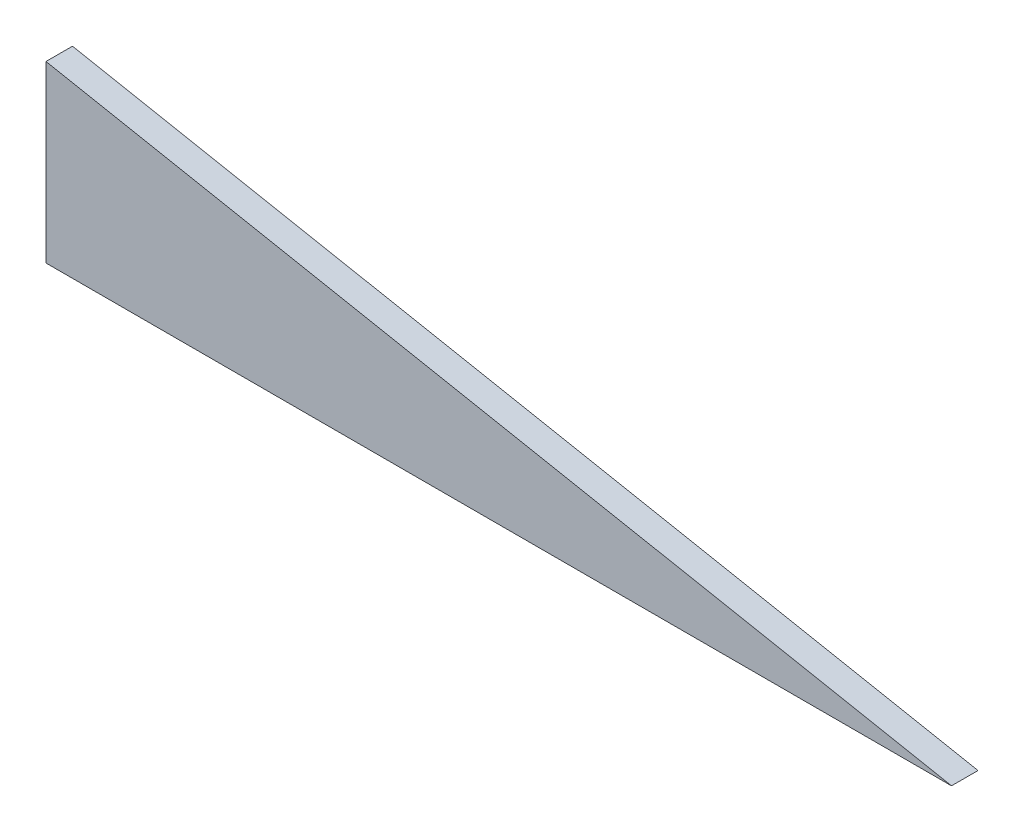
ISO-10303-21;
HEADER;
FILE_DESCRIPTION(('STEP AP214'),'2;1');
FILE_NAME('part.step','',(''),(''),'','','');
FILE_SCHEMA(('AUTOMOTIVE_DESIGN { 1 0 10303 214 1 1 1 1 }'));
ENDSEC;
DATA;
#1=APPLICATION_CONTEXT('core data for automotive mechanical design processes');
#2=APPLICATION_PROTOCOL_DEFINITION('international standard','automotive_design',2000,#1);
#3=PRODUCT_CONTEXT('',#1,'mechanical');
#4=PRODUCT('Part','Part','',(#3));
#5=PRODUCT_RELATED_PRODUCT_CATEGORY('part','',(#4));
#6=PRODUCT_DEFINITION_FORMATION('','',#4);
#7=PRODUCT_DEFINITION_CONTEXT('part definition',#1,'design');
#8=PRODUCT_DEFINITION('design','',#6,#7);
#9=PRODUCT_DEFINITION_SHAPE('','',#8);
#10=(LENGTH_UNIT() NAMED_UNIT(*) SI_UNIT(.MILLI.,.METRE.));
#11=(NAMED_UNIT(*) PLANE_ANGLE_UNIT() SI_UNIT($,.RADIAN.));
#12=(NAMED_UNIT(*) SI_UNIT($,.STERADIAN.) SOLID_ANGLE_UNIT());
#13=UNCERTAINTY_MEASURE_WITH_UNIT(LENGTH_MEASURE(1.E-05),#10,'distance_accuracy_value','');
#14=(GEOMETRIC_REPRESENTATION_CONTEXT(3) GLOBAL_UNCERTAINTY_ASSIGNED_CONTEXT((#13)) GLOBAL_UNIT_ASSIGNED_CONTEXT((#10,
#11,#12)) REPRESENTATION_CONTEXT('',''));
#15=CARTESIAN_POINT('',(0.,0.,0.));
#16=DIRECTION('',(0.,0.,1.));
#17=DIRECTION('',(1.,0.,0.));
#18=AXIS2_PLACEMENT_3D('',#15,#16,#17);
#19=CARTESIAN_POINT('',(-0.0100000000000477,-0.01,-378.));
#20=DIRECTION('',(0.,0.,1.));
#21=DIRECTION('',(1.,0.,0.));
#22=AXIS2_PLACEMENT_3D('',#19,#20,#21);
#23=PLANE('',#22);
#24=DIRECTION('',(0.,1.,0.));
#25=VECTOR('',#24,1.);
#26=CARTESIAN_POINT('',(0.,72.4539581785985,-378.));
#27=LINE('',#26,#25);
#28=CARTESIAN_POINT('',(0.,0.,-378.));
#29=VERTEX_POINT('',#28);
#30=CARTESIAN_POINT('',(0.,144.907916357197,-378.));
#31=VERTEX_POINT('',#30);
#32=EDGE_CURVE('E61',#29,#31,#27,.T.);
#33=ORIENTED_EDGE('',*,*,#32,.F.);
#34=DIRECTION('',(-1.,0.,0.));
#35=VECTOR('',#34,1.);
#36=CARTESIAN_POINT('',(375.794529752999,0.,-378.));
#37=LINE('',#36,#35);
#38=CARTESIAN_POINT('',(751.589059505997,0.,-378.));
#39=VERTEX_POINT('',#38);
#40=EDGE_CURVE('E21',#39,#29,#37,.T.);
#41=ORIENTED_EDGE('',*,*,#40,.F.);
#42=DIRECTION('',(0.981916313779954,-0.189315484661945,0.));
#43=VECTOR('',#42,1.);
#44=CARTESIAN_POINT('',(375.794529752999,72.4539581785987,-378.));
#45=LINE('',#44,#43);
#46=EDGE_CURVE('E67',#31,#39,#45,.T.);
#47=ORIENTED_EDGE('',*,*,#46,.F.);
#48=EDGE_LOOP('',(#33,#41,#47));
#49=FACE_BOUND('',#48,.T.);
#50=ADVANCED_FACE('F17',(#49),#23,.T.);
#51=CARTESIAN_POINT('',(-0.00999999999997669,0.,-400.01));
#52=DIRECTION('',(0.,-1.,0.));
#53=DIRECTION('',(1.,0.,0.));
#54=AXIS2_PLACEMENT_3D('',#51,#52,#53);
#55=PLANE('',#54);
#56=DIRECTION('',(0.,0.,1.));
#57=VECTOR('',#56,1.);
#58=CARTESIAN_POINT('',(0.,0.,-389.));
#59=LINE('',#58,#57);
#60=CARTESIAN_POINT('',(0.,0.,-400.));
#61=VERTEX_POINT('',#60);
#62=EDGE_CURVE('E57',#61,#29,#59,.T.);
#63=ORIENTED_EDGE('',*,*,#62,.F.);
#64=DIRECTION('',(-1.,0.,0.));
#65=VECTOR('',#64,1.);
#66=CARTESIAN_POINT('',(375.794529752998,0.,-400.));
#67=LINE('',#66,#65);
#68=CARTESIAN_POINT('',(751.589059505997,0.,-400.));
#69=VERTEX_POINT('',#68);
#70=EDGE_CURVE('E52',#69,#61,#67,.T.);
#71=ORIENTED_EDGE('',*,*,#70,.F.);
#72=DIRECTION('',(0.,0.,-1.));
#73=VECTOR('',#72,1.);
#74=CARTESIAN_POINT('',(751.589059505997,0.,-389.));
#75=LINE('',#74,#73);
#76=EDGE_CURVE('E70',#39,#69,#75,.T.);
#77=ORIENTED_EDGE('',*,*,#76,.F.);
#78=ORIENTED_EDGE('',*,*,#40,.T.);
#79=EDGE_LOOP('',(#63,#71,#77,#78));
#80=FACE_BOUND('',#79,.T.);
#81=ADVANCED_FACE('F58',(#80),#55,.T.);
#82=CARTESIAN_POINT('',(751.599059505997,-0.0100000000000178,-400.));
#83=DIRECTION('',(0.,0.,-1.));
#84=DIRECTION('',(-1.,0.,0.));
#85=AXIS2_PLACEMENT_3D('',#82,#83,#84);
#86=PLANE('',#85);
#87=ORIENTED_EDGE('',*,*,#70,.T.);
#88=DIRECTION('',(0.,-1.,0.));
#89=VECTOR('',#88,1.);
#90=CARTESIAN_POINT('',(0.,72.4539581785985,-400.));
#91=LINE('',#90,#89);
#92=CARTESIAN_POINT('',(0.,144.907916357197,-400.));
#93=VERTEX_POINT('',#92);
#94=EDGE_CURVE('E36',#93,#61,#91,.T.);
#95=ORIENTED_EDGE('',*,*,#94,.F.);
#96=DIRECTION('',(-0.981916313779954,0.189315484661945,0.));
#97=VECTOR('',#96,1.);
#98=CARTESIAN_POINT('',(375.794529752999,72.4539581785987,-400.));
#99=LINE('',#98,#97);
#100=EDGE_CURVE('E27',#69,#93,#99,.T.);
#101=ORIENTED_EDGE('',*,*,#100,.F.);
#102=EDGE_LOOP('',(#87,#95,#101));
#103=FACE_BOUND('',#102,.T.);
#104=ADVANCED_FACE('F53',(#103),#86,.T.);
#105=CARTESIAN_POINT('',(0.,-0.01,-400.01));
#106=DIRECTION('',(-1.,0.,0.));
#107=DIRECTION('',(0.,0.,1.));
#108=AXIS2_PLACEMENT_3D('',#105,#106,#107);
#109=PLANE('',#108);
#110=ORIENTED_EDGE('',*,*,#62,.T.);
#111=ORIENTED_EDGE('',*,*,#32,.T.);
#112=DIRECTION('',(0.,0.,1.));
#113=VECTOR('',#112,1.);
#114=CARTESIAN_POINT('',(0.,144.907916357197,-389.));
#115=LINE('',#114,#113);
#116=EDGE_CURVE('E11',#93,#31,#115,.T.);
#117=ORIENTED_EDGE('',*,*,#116,.F.);
#118=ORIENTED_EDGE('',*,*,#94,.T.);
#119=EDGE_LOOP('',(#110,#111,#117,#118));
#120=FACE_BOUND('',#119,.T.);
#121=ADVANCED_FACE('F63',(#120),#109,.T.);
#122=CARTESIAN_POINT('',(-0.00981916313779954,144.909809512044,-377.99));
#123=DIRECTION('',(0.189315484661945,0.981916313779954,0.));
#124=DIRECTION('',(0.981916313779954,-0.189315484661945,0.));
#125=AXIS2_PLACEMENT_3D('',#122,#123,#124);
#126=PLANE('',#125);
#127=ORIENTED_EDGE('',*,*,#100,.T.);
#128=ORIENTED_EDGE('',*,*,#116,.T.);
#129=ORIENTED_EDGE('',*,*,#46,.T.);
#130=ORIENTED_EDGE('',*,*,#76,.T.);
#131=EDGE_LOOP('',(#127,#128,#129,#130));
#132=FACE_BOUND('',#131,.T.);
#133=ADVANCED_FACE('F19',(#132),#126,.T.);
#134=CLOSED_SHELL('',(#50,#81,#104,#121,#133));
#135=MANIFOLD_SOLID_BREP('B1',#134);
#136=ADVANCED_BREP_SHAPE_REPRESENTATION('',(#18,#135),#14);
#137=SHAPE_DEFINITION_REPRESENTATION(#9,#136);
ENDSEC;
END-ISO-10303-21;
